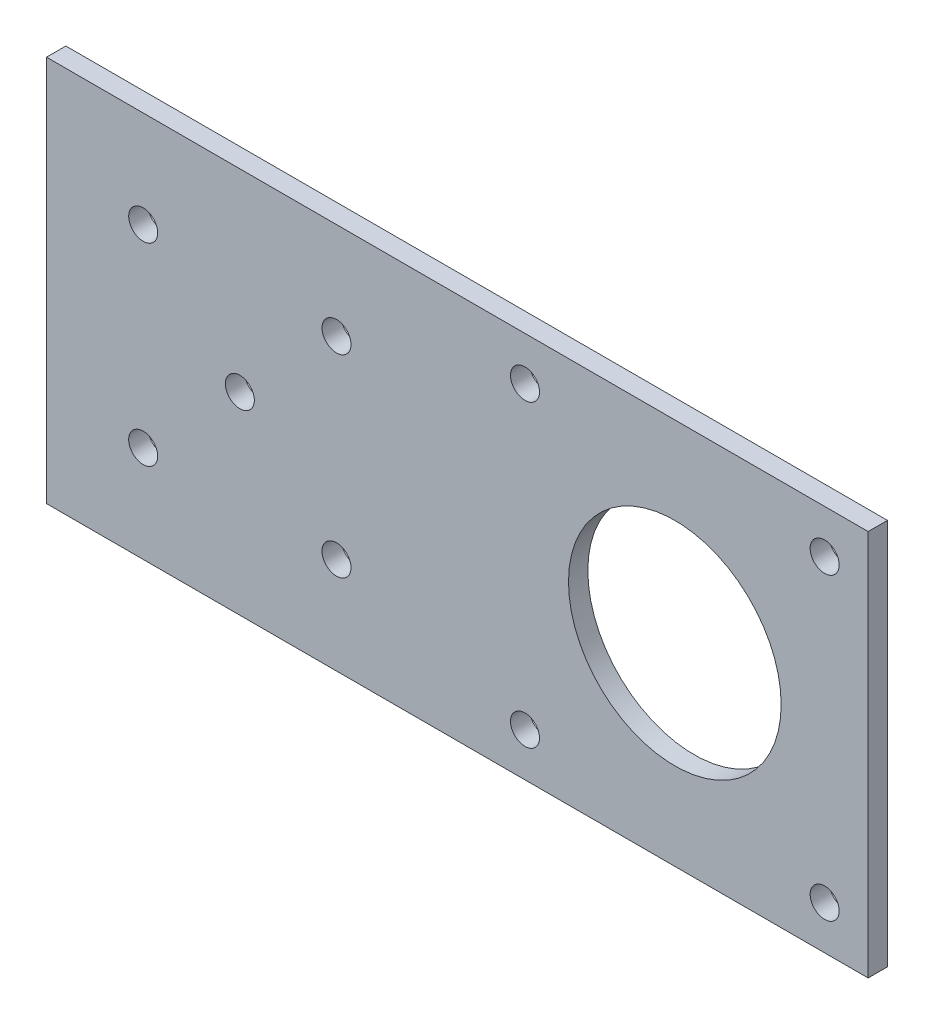
ISO-10303-21;
HEADER;
FILE_DESCRIPTION(('STEP AP214'),'2;1');
FILE_NAME('part.step','',(''),(''),'','','');
FILE_SCHEMA(('AUTOMOTIVE_DESIGN { 1 0 10303 214 1 1 1 1 }'));
ENDSEC;
DATA;
#1=APPLICATION_CONTEXT('core data for automotive mechanical design processes');
#2=APPLICATION_PROTOCOL_DEFINITION('international standard','automotive_design',2000,#1);
#3=PRODUCT_CONTEXT('',#1,'mechanical');
#4=PRODUCT('Part','Part','',(#3));
#5=PRODUCT_RELATED_PRODUCT_CATEGORY('part','',(#4));
#6=PRODUCT_DEFINITION_FORMATION('','',#4);
#7=PRODUCT_DEFINITION_CONTEXT('part definition',#1,'design');
#8=PRODUCT_DEFINITION('design','',#6,#7);
#9=PRODUCT_DEFINITION_SHAPE('','',#8);
#10=(LENGTH_UNIT() NAMED_UNIT(*) SI_UNIT(.MILLI.,.METRE.));
#11=(NAMED_UNIT(*) PLANE_ANGLE_UNIT() SI_UNIT($,.RADIAN.));
#12=(NAMED_UNIT(*) SI_UNIT($,.STERADIAN.) SOLID_ANGLE_UNIT());
#13=UNCERTAINTY_MEASURE_WITH_UNIT(LENGTH_MEASURE(1.E-05),#10,'distance_accuracy_value','');
#14=(GEOMETRIC_REPRESENTATION_CONTEXT(3) GLOBAL_UNCERTAINTY_ASSIGNED_CONTEXT((#13)) GLOBAL_UNIT_ASSIGNED_CONTEXT((#10,
#11,#12)) REPRESENTATION_CONTEXT('',''));
#15=CARTESIAN_POINT('',(0.,0.,0.));
#16=DIRECTION('',(0.,0.,1.));
#17=DIRECTION('',(1.,0.,0.));
#18=AXIS2_PLACEMENT_3D('',#15,#16,#17);
#19=CARTESIAN_POINT('',(42.5,20.,-1.));
#20=DIRECTION('',(-1.,0.,0.));
#21=DIRECTION('',(0.,-1.,0.));
#22=AXIS2_PLACEMENT_3D('',#19,#20,#21);
#23=PLANE('',#22);
#24=DIRECTION('',(0.,1.,0.));
#25=VECTOR('',#24,1.);
#26=CARTESIAN_POINT('',(42.5,20.,1.));
#27=LINE('',#26,#25);
#28=CARTESIAN_POINT('',(42.5,-20.,1.));
#29=VERTEX_POINT('',#28);
#30=CARTESIAN_POINT('',(42.5,20.,1.));
#31=VERTEX_POINT('',#30);
#32=EDGE_CURVE('E104',#29,#31,#27,.T.);
#33=ORIENTED_EDGE('',*,*,#32,.F.);
#34=DIRECTION('',(0.,0.,1.));
#35=VECTOR('',#34,1.);
#36=CARTESIAN_POINT('',(42.5,-20.,-1.));
#37=LINE('',#36,#35);
#38=CARTESIAN_POINT('',(42.5,-20.,-1.));
#39=VERTEX_POINT('',#38);
#40=EDGE_CURVE('E103',#39,#29,#37,.T.);
#41=ORIENTED_EDGE('',*,*,#40,.F.);
#42=DIRECTION('',(0.,1.,0.));
#43=VECTOR('',#42,1.);
#44=CARTESIAN_POINT('',(42.5,20.,-1.));
#45=LINE('',#44,#43);
#46=CARTESIAN_POINT('',(42.5,20.,-1.));
#47=VERTEX_POINT('',#46);
#48=EDGE_CURVE('E97',#39,#47,#45,.T.);
#49=ORIENTED_EDGE('',*,*,#48,.T.);
#50=DIRECTION('',(0.,0.,1.));
#51=VECTOR('',#50,1.);
#52=CARTESIAN_POINT('',(42.5,20.,-1.));
#53=LINE('',#52,#51);
#54=EDGE_CURVE('E11',#47,#31,#53,.T.);
#55=ORIENTED_EDGE('',*,*,#54,.T.);
#56=EDGE_LOOP('',(#33,#41,#49,#55));
#57=FACE_BOUND('',#56,.T.);
#58=ADVANCED_FACE('F37',(#57),#23,.F.);
#59=CARTESIAN_POINT('',(-42.5,20.,-1.));
#60=DIRECTION('',(0.,-1.,0.));
#61=DIRECTION('',(0.,0.,1.));
#62=AXIS2_PLACEMENT_3D('',#59,#60,#61);
#63=PLANE('',#62);
#64=DIRECTION('',(-1.,0.,0.));
#65=VECTOR('',#64,1.);
#66=CARTESIAN_POINT('',(-42.5,20.,1.));
#67=LINE('',#66,#65);
#68=CARTESIAN_POINT('',(-42.5,20.,1.));
#69=VERTEX_POINT('',#68);
#70=EDGE_CURVE('E106',#31,#69,#67,.T.);
#71=ORIENTED_EDGE('',*,*,#70,.F.);
#72=ORIENTED_EDGE('',*,*,#54,.F.);
#73=DIRECTION('',(-1.,0.,0.));
#74=VECTOR('',#73,1.);
#75=CARTESIAN_POINT('',(-42.5,20.,-1.));
#76=LINE('',#75,#74);
#77=CARTESIAN_POINT('',(-42.5,20.,-1.));
#78=VERTEX_POINT('',#77);
#79=EDGE_CURVE('E80',#47,#78,#76,.T.);
#80=ORIENTED_EDGE('',*,*,#79,.T.);
#81=DIRECTION('',(0.,0.,1.));
#82=VECTOR('',#81,1.);
#83=CARTESIAN_POINT('',(-42.5,20.,-1.));
#84=LINE('',#83,#82);
#85=EDGE_CURVE('E46',#78,#69,#84,.T.);
#86=ORIENTED_EDGE('',*,*,#85,.T.);
#87=EDGE_LOOP('',(#71,#72,#80,#86));
#88=FACE_BOUND('',#87,.T.);
#89=ADVANCED_FACE('F95',(#88),#63,.F.);
#90=CARTESIAN_POINT('',(-42.5,20.,-1.));
#91=DIRECTION('',(1.,0.,0.));
#92=DIRECTION('',(0.,0.,1.));
#93=AXIS2_PLACEMENT_3D('',#90,#91,#92);
#94=PLANE('',#93);
#95=DIRECTION('',(0.,-1.,0.));
#96=VECTOR('',#95,1.);
#97=CARTESIAN_POINT('',(-42.5,20.,1.));
#98=LINE('',#97,#96);
#99=CARTESIAN_POINT('',(-42.5,-20.,1.));
#100=VERTEX_POINT('',#99);
#101=EDGE_CURVE('E90',#69,#100,#98,.T.);
#102=ORIENTED_EDGE('',*,*,#101,.F.);
#103=ORIENTED_EDGE('',*,*,#85,.F.);
#104=DIRECTION('',(0.,-1.,0.));
#105=VECTOR('',#104,1.);
#106=CARTESIAN_POINT('',(-42.5,20.,-1.));
#107=LINE('',#106,#105);
#108=CARTESIAN_POINT('',(-42.5,-20.,-1.));
#109=VERTEX_POINT('',#108);
#110=EDGE_CURVE('E83',#78,#109,#107,.T.);
#111=ORIENTED_EDGE('',*,*,#110,.T.);
#112=DIRECTION('',(0.,0.,1.));
#113=VECTOR('',#112,1.);
#114=CARTESIAN_POINT('',(-42.5,-20.,-1.));
#115=LINE('',#114,#113);
#116=EDGE_CURVE('E93',#109,#100,#115,.T.);
#117=ORIENTED_EDGE('',*,*,#116,.T.);
#118=EDGE_LOOP('',(#102,#103,#111,#117));
#119=FACE_BOUND('',#118,.T.);
#120=ADVANCED_FACE('F89',(#119),#94,.F.);
#121=CARTESIAN_POINT('',(-42.5,-20.,-1.));
#122=DIRECTION('',(0.,1.,0.));
#123=DIRECTION('',(0.,0.,-1.));
#124=AXIS2_PLACEMENT_3D('',#121,#122,#123);
#125=PLANE('',#124);
#126=DIRECTION('',(1.,0.,0.));
#127=VECTOR('',#126,1.);
#128=CARTESIAN_POINT('',(-42.5,-20.,1.));
#129=LINE('',#128,#127);
#130=EDGE_CURVE('E69',#100,#29,#129,.T.);
#131=ORIENTED_EDGE('',*,*,#130,.F.);
#132=ORIENTED_EDGE('',*,*,#116,.F.);
#133=DIRECTION('',(1.,0.,0.));
#134=VECTOR('',#133,1.);
#135=CARTESIAN_POINT('',(-42.5,-20.,-1.));
#136=LINE('',#135,#134);
#137=EDGE_CURVE('E55',#109,#39,#136,.T.);
#138=ORIENTED_EDGE('',*,*,#137,.T.);
#139=ORIENTED_EDGE('',*,*,#40,.T.);
#140=EDGE_LOOP('',(#131,#132,#138,#139));
#141=FACE_BOUND('',#140,.T.);
#142=ADVANCED_FACE('F198',(#141),#125,.F.);
#143=CARTESIAN_POINT('',(0.,0.,-1.));
#144=DIRECTION('',(0.,0.,-1.));
#145=DIRECTION('',(1.,0.,0.));
#146=AXIS2_PLACEMENT_3D('',#143,#144,#145);
#147=PLANE('',#146);
#148=CARTESIAN_POINT('',(7.00000000000032,-15.5,-1.));
#149=DIRECTION('',(0.,0.,1.));
#150=DIRECTION('',(1.,0.,0.));
#151=AXIS2_PLACEMENT_3D('',#148,#149,#150);
#152=CIRCLE('',#151,1.5);
#153=CARTESIAN_POINT('',(8.50000000000033,-15.5,-1.));
#154=VERTEX_POINT('',#153);
#155=EDGE_CURVE('E307',#154,#154,#152,.T.);
#156=ORIENTED_EDGE('',*,*,#155,.T.);
#157=EDGE_LOOP('',(#156));
#158=FACE_BOUND('',#157,.T.);
#159=CARTESIAN_POINT('',(38.0000000000003,-15.5,-1.));
#160=DIRECTION('',(0.,0.,1.));
#161=DIRECTION('',(1.,0.,0.));
#162=AXIS2_PLACEMENT_3D('',#159,#160,#161);
#163=CIRCLE('',#162,1.5);
#164=CARTESIAN_POINT('',(39.5000000000003,-15.5,-1.));
#165=VERTEX_POINT('',#164);
#166=EDGE_CURVE('E308',#165,#165,#163,.T.);
#167=ORIENTED_EDGE('',*,*,#166,.T.);
#168=EDGE_LOOP('',(#167));
#169=FACE_BOUND('',#168,.T.);
#170=CARTESIAN_POINT('',(38.,15.5,-1.));
#171=DIRECTION('',(0.,0.,1.));
#172=DIRECTION('',(1.,0.,0.));
#173=AXIS2_PLACEMENT_3D('',#170,#171,#172);
#174=CIRCLE('',#173,1.5);
#175=CARTESIAN_POINT('',(39.5,15.5,-1.));
#176=VERTEX_POINT('',#175);
#177=EDGE_CURVE('E311',#176,#176,#174,.T.);
#178=ORIENTED_EDGE('',*,*,#177,.T.);
#179=EDGE_LOOP('',(#178));
#180=FACE_BOUND('',#179,.T.);
#181=CARTESIAN_POINT('',(7.,15.5,-1.));
#182=DIRECTION('',(0.,0.,1.));
#183=DIRECTION('',(1.,0.,0.));
#184=AXIS2_PLACEMENT_3D('',#181,#182,#183);
#185=CIRCLE('',#184,1.5);
#186=CARTESIAN_POINT('',(8.5,15.5,-1.));
#187=VERTEX_POINT('',#186);
#188=EDGE_CURVE('E117',#187,#187,#185,.T.);
#189=ORIENTED_EDGE('',*,*,#188,.T.);
#190=EDGE_LOOP('',(#189));
#191=FACE_BOUND('',#190,.T.);
#192=CARTESIAN_POINT('',(22.5,0.,-1.));
#193=DIRECTION('',(0.,0.,1.));
#194=DIRECTION('',(1.,0.,0.));
#195=AXIS2_PLACEMENT_3D('',#192,#193,#194);
#196=CIRCLE('',#195,11.);
#197=CARTESIAN_POINT('',(33.5,0.,-1.));
#198=VERTEX_POINT('',#197);
#199=EDGE_CURVE('E140',#198,#198,#196,.T.);
#200=ORIENTED_EDGE('',*,*,#199,.T.);
#201=EDGE_LOOP('',(#200));
#202=FACE_BOUND('',#201,.T.);
#203=CARTESIAN_POINT('',(-32.4999999999998,-10.,-1.));
#204=DIRECTION('',(0.,0.,1.));
#205=DIRECTION('',(1.,0.,0.));
#206=AXIS2_PLACEMENT_3D('',#203,#204,#205);
#207=CIRCLE('',#206,1.5);
#208=CARTESIAN_POINT('',(-30.9999999999998,-10.,-1.));
#209=VERTEX_POINT('',#208);
#210=EDGE_CURVE('E124',#209,#209,#207,.T.);
#211=ORIENTED_EDGE('',*,*,#210,.T.);
#212=EDGE_LOOP('',(#211));
#213=FACE_BOUND('',#212,.T.);
#214=CARTESIAN_POINT('',(-12.4999999999998,-10.,-1.));
#215=DIRECTION('',(0.,0.,1.));
#216=DIRECTION('',(1.,0.,0.));
#217=AXIS2_PLACEMENT_3D('',#214,#215,#216);
#218=CIRCLE('',#217,1.5);
#219=CARTESIAN_POINT('',(-10.9999999999998,-10.,-1.));
#220=VERTEX_POINT('',#219);
#221=EDGE_CURVE('E133',#220,#220,#218,.T.);
#222=ORIENTED_EDGE('',*,*,#221,.T.);
#223=EDGE_LOOP('',(#222));
#224=FACE_BOUND('',#223,.T.);
#225=CARTESIAN_POINT('',(-12.5,9.99999999999999,-1.));
#226=DIRECTION('',(0.,0.,1.));
#227=DIRECTION('',(1.,0.,0.));
#228=AXIS2_PLACEMENT_3D('',#225,#226,#227);
#229=CIRCLE('',#228,1.5);
#230=CARTESIAN_POINT('',(-11.,9.99999999999999,-1.));
#231=VERTEX_POINT('',#230);
#232=EDGE_CURVE('E153',#231,#231,#229,.T.);
#233=ORIENTED_EDGE('',*,*,#232,.T.);
#234=EDGE_LOOP('',(#233));
#235=FACE_BOUND('',#234,.T.);
#236=CARTESIAN_POINT('',(-32.5,9.99999999999999,-1.));
#237=DIRECTION('',(0.,0.,1.));
#238=DIRECTION('',(1.,0.,0.));
#239=AXIS2_PLACEMENT_3D('',#236,#237,#238);
#240=CIRCLE('',#239,1.5);
#241=CARTESIAN_POINT('',(-31.,9.99999999999999,-1.));
#242=VERTEX_POINT('',#241);
#243=EDGE_CURVE('E147',#242,#242,#240,.T.);
#244=ORIENTED_EDGE('',*,*,#243,.T.);
#245=EDGE_LOOP('',(#244));
#246=FACE_BOUND('',#245,.T.);
#247=CARTESIAN_POINT('',(-22.5,0.,-1.));
#248=DIRECTION('',(0.,0.,1.));
#249=DIRECTION('',(1.,0.,0.));
#250=AXIS2_PLACEMENT_3D('',#247,#248,#249);
#251=CIRCLE('',#250,1.5);
#252=CARTESIAN_POINT('',(-21.,0.,-1.));
#253=VERTEX_POINT('',#252);
#254=EDGE_CURVE('E141',#253,#253,#251,.T.);
#255=ORIENTED_EDGE('',*,*,#254,.T.);
#256=EDGE_LOOP('',(#255));
#257=FACE_BOUND('',#256,.T.);
#258=ORIENTED_EDGE('',*,*,#48,.F.);
#259=ORIENTED_EDGE('',*,*,#137,.F.);
#260=ORIENTED_EDGE('',*,*,#110,.F.);
#261=ORIENTED_EDGE('',*,*,#79,.F.);
#262=EDGE_LOOP('',(#258,#259,#260,#261));
#263=FACE_BOUND('',#262,.T.);
#264=ADVANCED_FACE('F85',(#158,#169,#180,#191,#202,#213,#224,#235,#246,#257,#263),#147,.T.);
#265=CARTESIAN_POINT('',(0.,0.,1.));
#266=DIRECTION('',(0.,0.,-1.));
#267=DIRECTION('',(1.,0.,0.));
#268=AXIS2_PLACEMENT_3D('',#265,#266,#267);
#269=PLANE('',#268);
#270=CARTESIAN_POINT('',(7.00000000000032,-15.5,1.));
#271=DIRECTION('',(0.,0.,1.));
#272=DIRECTION('',(1.,0.,0.));
#273=AXIS2_PLACEMENT_3D('',#270,#271,#272);
#274=CIRCLE('',#273,1.5);
#275=CARTESIAN_POINT('',(8.50000000000033,-15.5,1.));
#276=VERTEX_POINT('',#275);
#277=EDGE_CURVE('E40',#276,#276,#274,.T.);
#278=ORIENTED_EDGE('',*,*,#277,.F.);
#279=EDGE_LOOP('',(#278));
#280=FACE_BOUND('',#279,.T.);
#281=CARTESIAN_POINT('',(38.0000000000003,-15.5,1.));
#282=DIRECTION('',(0.,0.,1.));
#283=DIRECTION('',(1.,0.,0.));
#284=AXIS2_PLACEMENT_3D('',#281,#282,#283);
#285=CIRCLE('',#284,1.5);
#286=CARTESIAN_POINT('',(39.5000000000003,-15.5,1.));
#287=VERTEX_POINT('',#286);
#288=EDGE_CURVE('E119',#287,#287,#285,.T.);
#289=ORIENTED_EDGE('',*,*,#288,.F.);
#290=EDGE_LOOP('',(#289));
#291=FACE_BOUND('',#290,.T.);
#292=CARTESIAN_POINT('',(38.,15.5,1.));
#293=DIRECTION('',(0.,0.,1.));
#294=DIRECTION('',(1.,0.,0.));
#295=AXIS2_PLACEMENT_3D('',#292,#293,#294);
#296=CIRCLE('',#295,1.5);
#297=CARTESIAN_POINT('',(39.5,15.5,1.));
#298=VERTEX_POINT('',#297);
#299=EDGE_CURVE('E116',#298,#298,#296,.T.);
#300=ORIENTED_EDGE('',*,*,#299,.F.);
#301=EDGE_LOOP('',(#300));
#302=FACE_BOUND('',#301,.T.);
#303=CARTESIAN_POINT('',(7.,15.5,1.));
#304=DIRECTION('',(0.,0.,1.));
#305=DIRECTION('',(1.,0.,0.));
#306=AXIS2_PLACEMENT_3D('',#303,#304,#305);
#307=CIRCLE('',#306,1.5);
#308=CARTESIAN_POINT('',(8.5,15.5,1.));
#309=VERTEX_POINT('',#308);
#310=EDGE_CURVE('E113',#309,#309,#307,.T.);
#311=ORIENTED_EDGE('',*,*,#310,.F.);
#312=EDGE_LOOP('',(#311));
#313=FACE_BOUND('',#312,.T.);
#314=CARTESIAN_POINT('',(22.5,0.,1.));
#315=DIRECTION('',(0.,0.,1.));
#316=DIRECTION('',(1.,0.,0.));
#317=AXIS2_PLACEMENT_3D('',#314,#315,#316);
#318=CIRCLE('',#317,11.);
#319=CARTESIAN_POINT('',(33.5,0.,1.));
#320=VERTEX_POINT('',#319);
#321=EDGE_CURVE('E107',#320,#320,#318,.T.);
#322=ORIENTED_EDGE('',*,*,#321,.F.);
#323=EDGE_LOOP('',(#322));
#324=FACE_BOUND('',#323,.T.);
#325=CARTESIAN_POINT('',(-32.4999999999998,-10.,1.));
#326=DIRECTION('',(0.,0.,1.));
#327=DIRECTION('',(1.,0.,0.));
#328=AXIS2_PLACEMENT_3D('',#325,#326,#327);
#329=CIRCLE('',#328,1.5);
#330=CARTESIAN_POINT('',(-30.9999999999998,-10.,1.));
#331=VERTEX_POINT('',#330);
#332=EDGE_CURVE('E128',#331,#331,#329,.T.);
#333=ORIENTED_EDGE('',*,*,#332,.F.);
#334=EDGE_LOOP('',(#333));
#335=FACE_BOUND('',#334,.T.);
#336=CARTESIAN_POINT('',(-12.4999999999998,-10.,1.));
#337=DIRECTION('',(0.,0.,1.));
#338=DIRECTION('',(1.,0.,0.));
#339=AXIS2_PLACEMENT_3D('',#336,#337,#338);
#340=CIRCLE('',#339,1.5);
#341=CARTESIAN_POINT('',(-10.9999999999998,-10.,1.));
#342=VERTEX_POINT('',#341);
#343=EDGE_CURVE('E156',#342,#342,#340,.T.);
#344=ORIENTED_EDGE('',*,*,#343,.F.);
#345=EDGE_LOOP('',(#344));
#346=FACE_BOUND('',#345,.T.);
#347=CARTESIAN_POINT('',(-12.5,9.99999999999999,1.));
#348=DIRECTION('',(0.,0.,1.));
#349=DIRECTION('',(1.,0.,0.));
#350=AXIS2_PLACEMENT_3D('',#347,#348,#349);
#351=CIRCLE('',#350,1.5);
#352=CARTESIAN_POINT('',(-11.,9.99999999999999,1.));
#353=VERTEX_POINT('',#352);
#354=EDGE_CURVE('E150',#353,#353,#351,.T.);
#355=ORIENTED_EDGE('',*,*,#354,.F.);
#356=EDGE_LOOP('',(#355));
#357=FACE_BOUND('',#356,.T.);
#358=CARTESIAN_POINT('',(-32.5,9.99999999999999,1.));
#359=DIRECTION('',(0.,0.,1.));
#360=DIRECTION('',(1.,0.,0.));
#361=AXIS2_PLACEMENT_3D('',#358,#359,#360);
#362=CIRCLE('',#361,1.5);
#363=CARTESIAN_POINT('',(-31.,9.99999999999999,1.));
#364=VERTEX_POINT('',#363);
#365=EDGE_CURVE('E144',#364,#364,#362,.T.);
#366=ORIENTED_EDGE('',*,*,#365,.F.);
#367=EDGE_LOOP('',(#366));
#368=FACE_BOUND('',#367,.T.);
#369=CARTESIAN_POINT('',(-22.5,0.,1.));
#370=DIRECTION('',(0.,0.,1.));
#371=DIRECTION('',(1.,0.,0.));
#372=AXIS2_PLACEMENT_3D('',#369,#370,#371);
#373=CIRCLE('',#372,1.5);
#374=CARTESIAN_POINT('',(-21.,0.,1.));
#375=VERTEX_POINT('',#374);
#376=EDGE_CURVE('E137',#375,#375,#373,.T.);
#377=ORIENTED_EDGE('',*,*,#376,.F.);
#378=EDGE_LOOP('',(#377));
#379=FACE_BOUND('',#378,.T.);
#380=ORIENTED_EDGE('',*,*,#32,.T.);
#381=ORIENTED_EDGE('',*,*,#70,.T.);
#382=ORIENTED_EDGE('',*,*,#101,.T.);
#383=ORIENTED_EDGE('',*,*,#130,.T.);
#384=EDGE_LOOP('',(#380,#381,#382,#383));
#385=FACE_BOUND('',#384,.T.);
#386=ADVANCED_FACE('F187',(#280,#291,#302,#313,#324,#335,#346,#357,#368,#379,#385),#269,.F.);
#387=CARTESIAN_POINT('',(-22.5,0.,1.));
#388=DIRECTION('',(0.,0.,-1.));
#389=DIRECTION('',(1.,0.,0.));
#390=AXIS2_PLACEMENT_3D('',#387,#388,#389);
#391=CYLINDRICAL_SURFACE('',#390,1.5);
#392=ORIENTED_EDGE('',*,*,#376,.T.);
#393=EDGE_LOOP('',(#392));
#394=FACE_BOUND('',#393,.T.);
#395=ORIENTED_EDGE('',*,*,#254,.F.);
#396=EDGE_LOOP('',(#395));
#397=FACE_BOUND('',#396,.T.);
#398=ADVANCED_FACE('F189',(#394,#397),#391,.F.);
#399=CARTESIAN_POINT('',(-32.5,9.99999999999999,1.));
#400=DIRECTION('',(0.,0.,-1.));
#401=DIRECTION('',(1.,0.,0.));
#402=AXIS2_PLACEMENT_3D('',#399,#400,#401);
#403=CYLINDRICAL_SURFACE('',#402,1.5);
#404=ORIENTED_EDGE('',*,*,#365,.T.);
#405=EDGE_LOOP('',(#404));
#406=FACE_BOUND('',#405,.T.);
#407=ORIENTED_EDGE('',*,*,#243,.F.);
#408=EDGE_LOOP('',(#407));
#409=FACE_BOUND('',#408,.T.);
#410=ADVANCED_FACE('F176',(#406,#409),#403,.F.);
#411=CARTESIAN_POINT('',(-12.5,9.99999999999999,1.));
#412=DIRECTION('',(0.,0.,-1.));
#413=DIRECTION('',(1.,0.,0.));
#414=AXIS2_PLACEMENT_3D('',#411,#412,#413);
#415=CYLINDRICAL_SURFACE('',#414,1.5);
#416=ORIENTED_EDGE('',*,*,#354,.T.);
#417=EDGE_LOOP('',(#416));
#418=FACE_BOUND('',#417,.T.);
#419=ORIENTED_EDGE('',*,*,#232,.F.);
#420=EDGE_LOOP('',(#419));
#421=FACE_BOUND('',#420,.T.);
#422=ADVANCED_FACE('F166',(#418,#421),#415,.F.);
#423=CARTESIAN_POINT('',(-12.4999999999998,-10.,1.));
#424=DIRECTION('',(0.,0.,-1.));
#425=DIRECTION('',(1.,0.,0.));
#426=AXIS2_PLACEMENT_3D('',#423,#424,#425);
#427=CYLINDRICAL_SURFACE('',#426,1.5);
#428=ORIENTED_EDGE('',*,*,#343,.T.);
#429=EDGE_LOOP('',(#428));
#430=FACE_BOUND('',#429,.T.);
#431=ORIENTED_EDGE('',*,*,#221,.F.);
#432=EDGE_LOOP('',(#431));
#433=FACE_BOUND('',#432,.T.);
#434=ADVANCED_FACE('F163',(#430,#433),#427,.F.);
#435=CARTESIAN_POINT('',(-32.4999999999998,-10.,1.));
#436=DIRECTION('',(0.,0.,-1.));
#437=DIRECTION('',(1.,0.,0.));
#438=AXIS2_PLACEMENT_3D('',#435,#436,#437);
#439=CYLINDRICAL_SURFACE('',#438,1.5);
#440=ORIENTED_EDGE('',*,*,#332,.T.);
#441=EDGE_LOOP('',(#440));
#442=FACE_BOUND('',#441,.T.);
#443=ORIENTED_EDGE('',*,*,#210,.F.);
#444=EDGE_LOOP('',(#443));
#445=FACE_BOUND('',#444,.T.);
#446=ADVANCED_FACE('F165',(#442,#445),#439,.F.);
#447=CARTESIAN_POINT('',(22.5,0.,1.));
#448=DIRECTION('',(0.,0.,-1.));
#449=DIRECTION('',(1.,0.,0.));
#450=AXIS2_PLACEMENT_3D('',#447,#448,#449);
#451=CYLINDRICAL_SURFACE('',#450,11.);
#452=ORIENTED_EDGE('',*,*,#321,.T.);
#453=EDGE_LOOP('',(#452));
#454=FACE_BOUND('',#453,.T.);
#455=ORIENTED_EDGE('',*,*,#199,.F.);
#456=EDGE_LOOP('',(#455));
#457=FACE_BOUND('',#456,.T.);
#458=ADVANCED_FACE('F173',(#454,#457),#451,.F.);
#459=CARTESIAN_POINT('',(7.,15.5,9.));
#460=DIRECTION('',(0.,0.,-1.));
#461=DIRECTION('',(1.,0.,0.));
#462=AXIS2_PLACEMENT_3D('',#459,#460,#461);
#463=CYLINDRICAL_SURFACE('',#462,1.5);
#464=ORIENTED_EDGE('',*,*,#188,.F.);
#465=EDGE_LOOP('',(#464));
#466=FACE_BOUND('',#465,.T.);
#467=ORIENTED_EDGE('',*,*,#310,.T.);
#468=EDGE_LOOP('',(#467));
#469=FACE_BOUND('',#468,.T.);
#470=ADVANCED_FACE('F261',(#466,#469),#463,.F.);
#471=CARTESIAN_POINT('',(38.,15.5,9.));
#472=DIRECTION('',(0.,0.,-1.));
#473=DIRECTION('',(1.,0.,0.));
#474=AXIS2_PLACEMENT_3D('',#471,#472,#473);
#475=CYLINDRICAL_SURFACE('',#474,1.5);
#476=ORIENTED_EDGE('',*,*,#177,.F.);
#477=EDGE_LOOP('',(#476));
#478=FACE_BOUND('',#477,.T.);
#479=ORIENTED_EDGE('',*,*,#299,.T.);
#480=EDGE_LOOP('',(#479));
#481=FACE_BOUND('',#480,.T.);
#482=ADVANCED_FACE('F271',(#478,#481),#475,.F.);
#483=CARTESIAN_POINT('',(38.0000000000003,-15.5,9.));
#484=DIRECTION('',(0.,0.,-1.));
#485=DIRECTION('',(1.,0.,0.));
#486=AXIS2_PLACEMENT_3D('',#483,#484,#485);
#487=CYLINDRICAL_SURFACE('',#486,1.5);
#488=ORIENTED_EDGE('',*,*,#166,.F.);
#489=EDGE_LOOP('',(#488));
#490=FACE_BOUND('',#489,.T.);
#491=ORIENTED_EDGE('',*,*,#288,.T.);
#492=EDGE_LOOP('',(#491));
#493=FACE_BOUND('',#492,.T.);
#494=ADVANCED_FACE('F281',(#490,#493),#487,.F.);
#495=CARTESIAN_POINT('',(7.00000000000032,-15.5,9.));
#496=DIRECTION('',(0.,0.,-1.));
#497=DIRECTION('',(1.,0.,0.));
#498=AXIS2_PLACEMENT_3D('',#495,#496,#497);
#499=CYLINDRICAL_SURFACE('',#498,1.5);
#500=ORIENTED_EDGE('',*,*,#155,.F.);
#501=EDGE_LOOP('',(#500));
#502=FACE_BOUND('',#501,.T.);
#503=ORIENTED_EDGE('',*,*,#277,.T.);
#504=EDGE_LOOP('',(#503));
#505=FACE_BOUND('',#504,.T.);
#506=ADVANCED_FACE('F291',(#502,#505),#499,.F.);
#507=CLOSED_SHELL('',(#58,#89,#120,#142,#264,#386,#398,#410,#422,#434,#446,#458,#470,#482,#494,#506));
#508=MANIFOLD_SOLID_BREP('B2',#507);
#509=ADVANCED_BREP_SHAPE_REPRESENTATION('',(#18,#508),#14);
#510=SHAPE_DEFINITION_REPRESENTATION(#9,#509);
ENDSEC;
END-ISO-10303-21;
